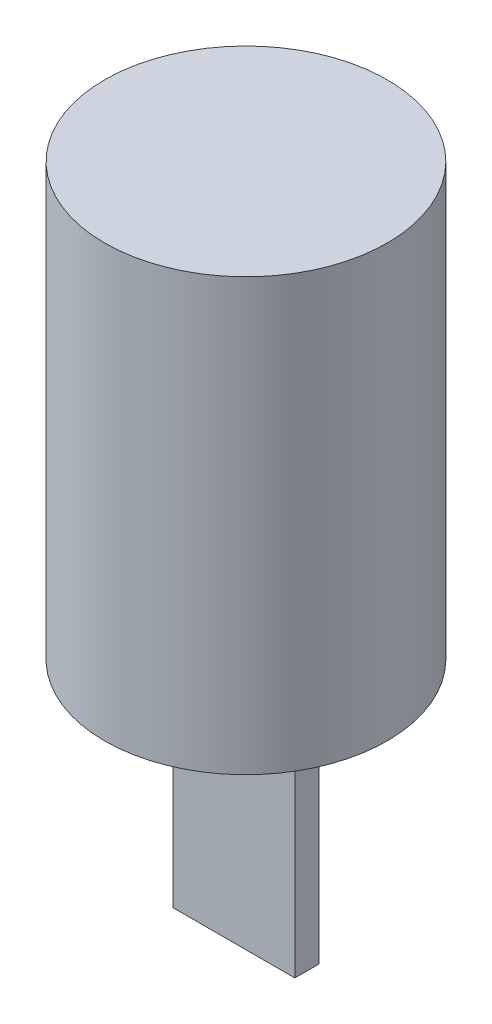
ISO-10303-21;
HEADER;
FILE_DESCRIPTION(('STEP AP214'),'2;1');
FILE_NAME('part.step','',(''),(''),'','','');
FILE_SCHEMA(('AUTOMOTIVE_DESIGN { 1 0 10303 214 1 1 1 1 }'));
ENDSEC;
DATA;
#1=APPLICATION_CONTEXT('core data for automotive mechanical design processes');
#2=APPLICATION_PROTOCOL_DEFINITION('international standard','automotive_design',2000,#1);
#3=PRODUCT_CONTEXT('',#1,'mechanical');
#4=PRODUCT('Part','Part','',(#3));
#5=PRODUCT_RELATED_PRODUCT_CATEGORY('part','',(#4));
#6=PRODUCT_DEFINITION_FORMATION('','',#4);
#7=PRODUCT_DEFINITION_CONTEXT('part definition',#1,'design');
#8=PRODUCT_DEFINITION('design','',#6,#7);
#9=PRODUCT_DEFINITION_SHAPE('','',#8);
#10=(LENGTH_UNIT() NAMED_UNIT(*) SI_UNIT(.MILLI.,.METRE.));
#11=(NAMED_UNIT(*) PLANE_ANGLE_UNIT() SI_UNIT($,.RADIAN.));
#12=(NAMED_UNIT(*) SI_UNIT($,.STERADIAN.) SOLID_ANGLE_UNIT());
#13=UNCERTAINTY_MEASURE_WITH_UNIT(LENGTH_MEASURE(1.E-05),#10,'distance_accuracy_value','');
#14=(GEOMETRIC_REPRESENTATION_CONTEXT(3) GLOBAL_UNCERTAINTY_ASSIGNED_CONTEXT((#13)) GLOBAL_UNIT_ASSIGNED_CONTEXT((#10,
#11,#12)) REPRESENTATION_CONTEXT('',''));
#15=CARTESIAN_POINT('',(0.,0.,0.));
#16=DIRECTION('',(0.,0.,1.));
#17=DIRECTION('',(1.,0.,0.));
#18=AXIS2_PLACEMENT_3D('',#15,#16,#17);
#19=CARTESIAN_POINT('',(0.,0.,0.));
#20=DIRECTION('',(0.,1.,0.));
#21=DIRECTION('',(0.,0.,1.));
#22=AXIS2_PLACEMENT_3D('',#19,#20,#21);
#23=PLANE('',#22);
#24=CARTESIAN_POINT('',(0.,0.,0.));
#25=DIRECTION('',(0.,1.,0.));
#26=DIRECTION('',(0.,0.,1.));
#27=AXIS2_PLACEMENT_3D('',#24,#25,#26);
#28=CIRCLE('',#27,2.95);
#29=CARTESIAN_POINT('',(0.,0.,2.95));
#30=VERTEX_POINT('',#29);
#31=EDGE_CURVE('E37',#30,#30,#28,.T.);
#32=ORIENTED_EDGE('',*,*,#31,.F.);
#33=EDGE_LOOP('',(#32));
#34=FACE_BOUND('',#33,.T.);
#35=DIRECTION('',(0.,0.,1.));
#36=VECTOR('',#35,1.);
#37=CARTESIAN_POINT('',(1.27,0.,0.25));
#38=LINE('',#37,#36);
#39=CARTESIAN_POINT('',(1.27,0.,-0.25));
#40=VERTEX_POINT('',#39);
#41=CARTESIAN_POINT('',(1.27,0.,0.25));
#42=VERTEX_POINT('',#41);
#43=EDGE_CURVE('E94',#40,#42,#38,.T.);
#44=ORIENTED_EDGE('',*,*,#43,.F.);
#45=DIRECTION('',(1.,0.,0.));
#46=VECTOR('',#45,1.);
#47=CARTESIAN_POINT('',(1.27,0.,-0.25));
#48=LINE('',#47,#46);
#49=CARTESIAN_POINT('',(-1.27,0.,-0.25));
#50=VERTEX_POINT('',#49);
#51=EDGE_CURVE('E91',#50,#40,#48,.T.);
#52=ORIENTED_EDGE('',*,*,#51,.F.);
#53=DIRECTION('',(0.,0.,-1.));
#54=VECTOR('',#53,1.);
#55=CARTESIAN_POINT('',(-1.27,0.,0.25));
#56=LINE('',#55,#54);
#57=CARTESIAN_POINT('',(-1.27,0.,0.25));
#58=VERTEX_POINT('',#57);
#59=EDGE_CURVE('E53',#58,#50,#56,.T.);
#60=ORIENTED_EDGE('',*,*,#59,.F.);
#61=DIRECTION('',(-1.,0.,0.));
#62=VECTOR('',#61,1.);
#63=CARTESIAN_POINT('',(1.27,0.,0.25));
#64=LINE('',#63,#62);
#65=EDGE_CURVE('E48',#42,#58,#64,.T.);
#66=ORIENTED_EDGE('',*,*,#65,.F.);
#67=EDGE_LOOP('',(#44,#52,#60,#66));
#68=FACE_BOUND('',#67,.T.);
#69=ADVANCED_FACE('F33',(#34,#68),#23,.F.);
#70=CARTESIAN_POINT('',(0.,9.,0.));
#71=DIRECTION('',(0.,-1.,0.));
#72=DIRECTION('',(0.,0.,-1.));
#73=AXIS2_PLACEMENT_3D('',#70,#71,#72);
#74=CYLINDRICAL_SURFACE('',#73,2.95);
#75=CARTESIAN_POINT('',(0.,9.,0.));
#76=DIRECTION('',(0.,1.,0.));
#77=DIRECTION('',(0.,0.,1.));
#78=AXIS2_PLACEMENT_3D('',#75,#76,#77);
#79=CIRCLE('',#78,2.95);
#80=CARTESIAN_POINT('',(0.,9.,2.95));
#81=VERTEX_POINT('',#80);
#82=EDGE_CURVE('E11',#81,#81,#79,.T.);
#83=ORIENTED_EDGE('',*,*,#82,.F.);
#84=EDGE_LOOP('',(#83));
#85=FACE_BOUND('',#84,.T.);
#86=ORIENTED_EDGE('',*,*,#31,.T.);
#87=EDGE_LOOP('',(#86));
#88=FACE_BOUND('',#87,.T.);
#89=ADVANCED_FACE('F35',(#85,#88),#74,.T.);
#90=CARTESIAN_POINT('',(0.,9.,0.));
#91=DIRECTION('',(0.,1.,0.));
#92=DIRECTION('',(0.,0.,1.));
#93=AXIS2_PLACEMENT_3D('',#90,#91,#92);
#94=PLANE('',#93);
#95=ORIENTED_EDGE('',*,*,#82,.T.);
#96=EDGE_LOOP('',(#95));
#97=FACE_BOUND('',#96,.T.);
#98=ADVANCED_FACE('F120',(#97),#94,.T.);
#99=CARTESIAN_POINT('',(1.27,-5.,0.25));
#100=DIRECTION('',(-1.,0.,0.));
#101=DIRECTION('',(0.,0.,1.));
#102=AXIS2_PLACEMENT_3D('',#99,#100,#101);
#103=PLANE('',#102);
#104=ORIENTED_EDGE('',*,*,#43,.T.);
#105=DIRECTION('',(0.,1.,0.));
#106=VECTOR('',#105,1.);
#107=CARTESIAN_POINT('',(1.27,-5.,0.25));
#108=LINE('',#107,#106);
#109=CARTESIAN_POINT('',(1.27,-5.,0.25));
#110=VERTEX_POINT('',#109);
#111=EDGE_CURVE('E75',#110,#42,#108,.T.);
#112=ORIENTED_EDGE('',*,*,#111,.F.);
#113=DIRECTION('',(0.,0.,1.));
#114=VECTOR('',#113,1.);
#115=CARTESIAN_POINT('',(1.27,-5.,0.25));
#116=LINE('',#115,#114);
#117=CARTESIAN_POINT('',(1.27,-5.,-0.25));
#118=VERTEX_POINT('',#117);
#119=EDGE_CURVE('E82',#118,#110,#116,.T.);
#120=ORIENTED_EDGE('',*,*,#119,.F.);
#121=DIRECTION('',(0.,1.,0.));
#122=VECTOR('',#121,1.);
#123=CARTESIAN_POINT('',(1.27,-5.,-0.25));
#124=LINE('',#123,#122);
#125=EDGE_CURVE('E102',#118,#40,#124,.T.);
#126=ORIENTED_EDGE('',*,*,#125,.T.);
#127=EDGE_LOOP('',(#104,#112,#120,#126));
#128=FACE_BOUND('',#127,.T.);
#129=ADVANCED_FACE('F93',(#128),#103,.F.);
#130=CARTESIAN_POINT('',(1.27,-5.,0.25));
#131=DIRECTION('',(0.,0.,-1.));
#132=DIRECTION('',(-1.,0.,0.));
#133=AXIS2_PLACEMENT_3D('',#130,#131,#132);
#134=PLANE('',#133);
#135=ORIENTED_EDGE('',*,*,#65,.T.);
#136=DIRECTION('',(0.,1.,0.));
#137=VECTOR('',#136,1.);
#138=CARTESIAN_POINT('',(-1.27,-5.,0.25));
#139=LINE('',#138,#137);
#140=CARTESIAN_POINT('',(-1.27,-5.,0.25));
#141=VERTEX_POINT('',#140);
#142=EDGE_CURVE('E78',#141,#58,#139,.T.);
#143=ORIENTED_EDGE('',*,*,#142,.F.);
#144=DIRECTION('',(-1.,0.,0.));
#145=VECTOR('',#144,1.);
#146=CARTESIAN_POINT('',(1.27,-5.,0.25));
#147=LINE('',#146,#145);
#148=EDGE_CURVE('E71',#110,#141,#147,.T.);
#149=ORIENTED_EDGE('',*,*,#148,.F.);
#150=ORIENTED_EDGE('',*,*,#111,.T.);
#151=EDGE_LOOP('',(#135,#143,#149,#150));
#152=FACE_BOUND('',#151,.T.);
#153=ADVANCED_FACE('F73',(#152),#134,.F.);
#154=CARTESIAN_POINT('',(-1.27,-5.,0.25));
#155=DIRECTION('',(1.,0.,0.));
#156=DIRECTION('',(0.,0.,-1.));
#157=AXIS2_PLACEMENT_3D('',#154,#155,#156);
#158=PLANE('',#157);
#159=ORIENTED_EDGE('',*,*,#59,.T.);
#160=DIRECTION('',(0.,1.,0.));
#161=VECTOR('',#160,1.);
#162=CARTESIAN_POINT('',(-1.27,-5.,-0.25));
#163=LINE('',#162,#161);
#164=CARTESIAN_POINT('',(-1.27,-5.,-0.25));
#165=VERTEX_POINT('',#164);
#166=EDGE_CURVE('E97',#165,#50,#163,.T.);
#167=ORIENTED_EDGE('',*,*,#166,.F.);
#168=DIRECTION('',(0.,0.,-1.));
#169=VECTOR('',#168,1.);
#170=CARTESIAN_POINT('',(-1.27,-5.,0.25));
#171=LINE('',#170,#169);
#172=EDGE_CURVE('E81',#141,#165,#171,.T.);
#173=ORIENTED_EDGE('',*,*,#172,.F.);
#174=ORIENTED_EDGE('',*,*,#142,.T.);
#175=EDGE_LOOP('',(#159,#167,#173,#174));
#176=FACE_BOUND('',#175,.T.);
#177=ADVANCED_FACE('F112',(#176),#158,.F.);
#178=CARTESIAN_POINT('',(1.27,-5.,-0.25));
#179=DIRECTION('',(0.,0.,1.));
#180=DIRECTION('',(1.,0.,0.));
#181=AXIS2_PLACEMENT_3D('',#178,#179,#180);
#182=PLANE('',#181);
#183=ORIENTED_EDGE('',*,*,#51,.T.);
#184=ORIENTED_EDGE('',*,*,#125,.F.);
#185=DIRECTION('',(1.,0.,0.));
#186=VECTOR('',#185,1.);
#187=CARTESIAN_POINT('',(1.27,-5.,-0.25));
#188=LINE('',#187,#186);
#189=EDGE_CURVE('E87',#165,#118,#188,.T.);
#190=ORIENTED_EDGE('',*,*,#189,.F.);
#191=ORIENTED_EDGE('',*,*,#166,.T.);
#192=EDGE_LOOP('',(#183,#184,#190,#191));
#193=FACE_BOUND('',#192,.T.);
#194=ADVANCED_FACE('F114',(#193),#182,.F.);
#195=CARTESIAN_POINT('',(0.,-5.,0.));
#196=DIRECTION('',(0.,1.,0.));
#197=DIRECTION('',(0.,0.,1.));
#198=AXIS2_PLACEMENT_3D('',#195,#196,#197);
#199=PLANE('',#198);
#200=ORIENTED_EDGE('',*,*,#119,.T.);
#201=ORIENTED_EDGE('',*,*,#148,.T.);
#202=ORIENTED_EDGE('',*,*,#172,.T.);
#203=ORIENTED_EDGE('',*,*,#189,.T.);
#204=EDGE_LOOP('',(#200,#201,#202,#203));
#205=FACE_BOUND('',#204,.T.);
#206=ADVANCED_FACE('F85',(#205),#199,.F.);
#207=CLOSED_SHELL('',(#69,#89,#98,#129,#153,#177,#194,#206));
#208=MANIFOLD_SOLID_BREP('B2',#207);
#209=ADVANCED_BREP_SHAPE_REPRESENTATION('',(#18,#208),#14);
#210=SHAPE_DEFINITION_REPRESENTATION(#9,#209);
ENDSEC;
END-ISO-10303-21;
